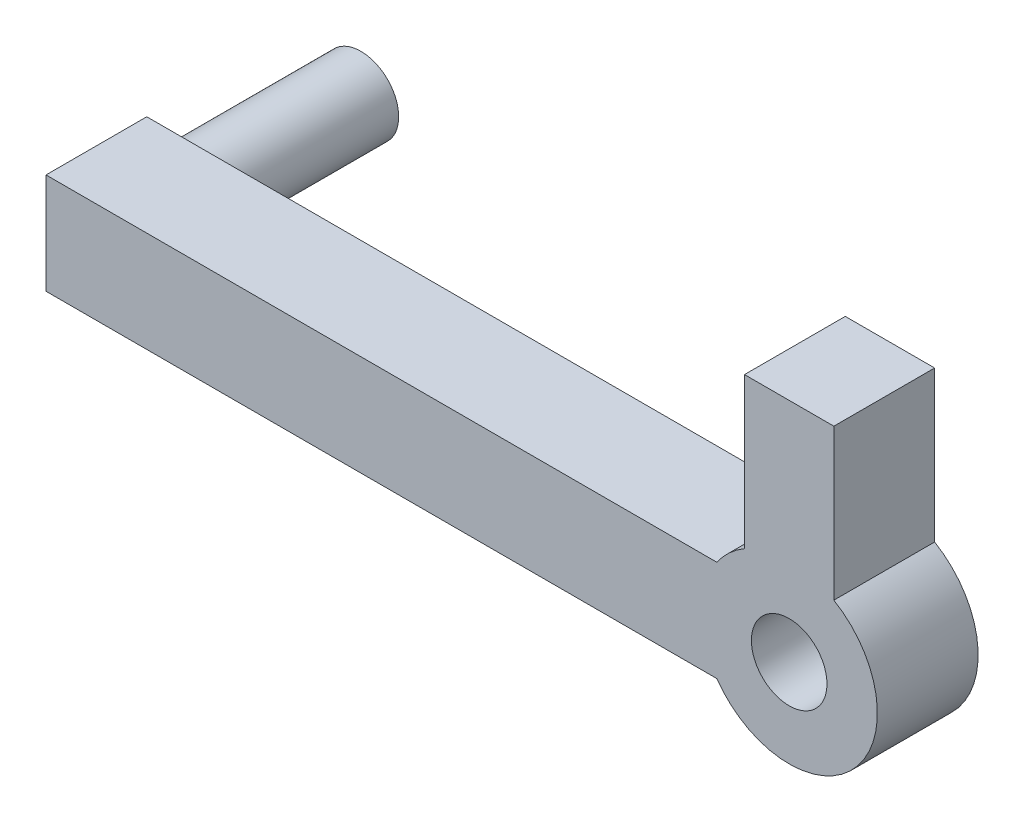
ISO-10303-21;
HEADER;
FILE_DESCRIPTION(('STEP AP214'),'2;1');
FILE_NAME('part.step','',(''),(''),'','','');
FILE_SCHEMA(('AUTOMOTIVE_DESIGN { 1 0 10303 214 1 1 1 1 }'));
ENDSEC;
DATA;
#1=APPLICATION_CONTEXT('core data for automotive mechanical design processes');
#2=APPLICATION_PROTOCOL_DEFINITION('international standard','automotive_design',2000,#1);
#3=PRODUCT_CONTEXT('',#1,'mechanical');
#4=PRODUCT('Part','Part','',(#3));
#5=PRODUCT_RELATED_PRODUCT_CATEGORY('part','',(#4));
#6=PRODUCT_DEFINITION_FORMATION('','',#4);
#7=PRODUCT_DEFINITION_CONTEXT('part definition',#1,'design');
#8=PRODUCT_DEFINITION('design','',#6,#7);
#9=PRODUCT_DEFINITION_SHAPE('','',#8);
#10=(LENGTH_UNIT() NAMED_UNIT(*) SI_UNIT(.MILLI.,.METRE.));
#11=(NAMED_UNIT(*) PLANE_ANGLE_UNIT() SI_UNIT($,.RADIAN.));
#12=(NAMED_UNIT(*) SI_UNIT($,.STERADIAN.) SOLID_ANGLE_UNIT());
#13=UNCERTAINTY_MEASURE_WITH_UNIT(LENGTH_MEASURE(1.E-05),#10,'distance_accuracy_value','');
#14=(GEOMETRIC_REPRESENTATION_CONTEXT(3) GLOBAL_UNCERTAINTY_ASSIGNED_CONTEXT((#13)) GLOBAL_UNIT_ASSIGNED_CONTEXT((#10,
#11,#12)) REPRESENTATION_CONTEXT('',''));
#15=CARTESIAN_POINT('',(0.,0.,0.));
#16=DIRECTION('',(0.,0.,1.));
#17=DIRECTION('',(1.,0.,0.));
#18=AXIS2_PLACEMENT_3D('',#15,#16,#17);
#19=CARTESIAN_POINT('',(147.5,10.,20.));
#20=DIRECTION('',(0.,0.,-1.));
#21=DIRECTION('',(-1.,0.,0.));
#22=AXIS2_PLACEMENT_3D('',#19,#20,#21);
#23=CYLINDRICAL_SURFACE('',#22,17.5);
#24=CARTESIAN_POINT('',(147.5,10.,20.));
#25=DIRECTION('',(0.,0.,1.));
#26=DIRECTION('',(1.,0.,0.));
#27=AXIS2_PLACEMENT_3D('',#24,#25,#26);
#28=CIRCLE('',#27,17.5);
#29=CARTESIAN_POINT('',(138.629925332049,25.0854822722038,20.));
#30=VERTEX_POINT('',#29);
#31=CARTESIAN_POINT('',(133.138593383655,20.,20.));
#32=VERTEX_POINT('',#31);
#33=EDGE_CURVE('E62',#30,#32,#28,.T.);
#34=ORIENTED_EDGE('',*,*,#33,.F.);
#35=DIRECTION('',(0.,0.,-1.));
#36=VECTOR('',#35,1.);
#37=CARTESIAN_POINT('',(138.629925332049,25.0854822722038,20.));
#38=LINE('',#37,#36);
#39=CARTESIAN_POINT('',(138.629925332049,25.0854822722038,0.));
#40=VERTEX_POINT('',#39);
#41=EDGE_CURVE('E122',#30,#40,#38,.T.);
#42=ORIENTED_EDGE('',*,*,#41,.T.);
#43=CARTESIAN_POINT('',(147.5,10.,0.));
#44=DIRECTION('',(0.,0.,1.));
#45=DIRECTION('',(1.,0.,0.));
#46=AXIS2_PLACEMENT_3D('',#43,#44,#45);
#47=CIRCLE('',#46,17.5);
#48=CARTESIAN_POINT('',(133.138593383655,20.,0.));
#49=VERTEX_POINT('',#48);
#50=EDGE_CURVE('E203',#40,#49,#47,.T.);
#51=ORIENTED_EDGE('',*,*,#50,.T.);
#52=DIRECTION('',(0.,0.,-1.));
#53=VECTOR('',#52,1.);
#54=CARTESIAN_POINT('',(133.138593383655,20.,20.));
#55=LINE('',#54,#53);
#56=EDGE_CURVE('E213',#32,#49,#55,.T.);
#57=ORIENTED_EDGE('',*,*,#56,.F.);
#58=EDGE_LOOP('',(#34,#42,#51,#57));
#59=FACE_BOUND('',#58,.T.);
#60=ADVANCED_FACE('F46',(#59),#23,.T.);
#61=CARTESIAN_POINT('',(0.,0.,20.));
#62=DIRECTION('',(-1.,0.,0.));
#63=DIRECTION('',(0.,0.,1.));
#64=AXIS2_PLACEMENT_3D('',#61,#62,#63);
#65=PLANE('',#64);
#66=DIRECTION('',(0.,1.,0.));
#67=VECTOR('',#66,1.);
#68=CARTESIAN_POINT('',(0.,0.,0.));
#69=LINE('',#68,#67);
#70=CARTESIAN_POINT('',(0.,0.,0.));
#71=VERTEX_POINT('',#70);
#72=CARTESIAN_POINT('',(0.,10.,0.));
#73=VERTEX_POINT('',#72);
#74=EDGE_CURVE('E196',#71,#73,#69,.T.);
#75=ORIENTED_EDGE('',*,*,#74,.F.);
#76=DIRECTION('',(0.,0.,-1.));
#77=VECTOR('',#76,1.);
#78=CARTESIAN_POINT('',(0.,0.,20.));
#79=LINE('',#78,#77);
#80=CARTESIAN_POINT('',(0.,0.,20.));
#81=VERTEX_POINT('',#80);
#82=EDGE_CURVE('E11',#81,#71,#79,.T.);
#83=ORIENTED_EDGE('',*,*,#82,.F.);
#84=DIRECTION('',(0.,1.,0.));
#85=VECTOR('',#84,1.);
#86=CARTESIAN_POINT('',(0.,0.,20.));
#87=LINE('',#86,#85);
#88=CARTESIAN_POINT('',(0.,20.,20.));
#89=VERTEX_POINT('',#88);
#90=EDGE_CURVE('E175',#81,#89,#87,.T.);
#91=ORIENTED_EDGE('',*,*,#90,.T.);
#92=DIRECTION('',(0.,0.,-1.));
#93=VECTOR('',#92,1.);
#94=CARTESIAN_POINT('',(0.,20.,20.));
#95=LINE('',#94,#93);
#96=CARTESIAN_POINT('',(0.,20.,0.));
#97=VERTEX_POINT('',#96);
#98=EDGE_CURVE('E191',#89,#97,#95,.T.);
#99=ORIENTED_EDGE('',*,*,#98,.T.);
#100=EDGE_CURVE('E195',#73,#97,#69,.T.);
#101=ORIENTED_EDGE('',*,*,#100,.F.);
#102=EDGE_LOOP('',(#75,#83,#91,#99,#101));
#103=FACE_BOUND('',#102,.T.);
#104=ADVANCED_FACE('F232',(#103),#65,.T.);
#105=CARTESIAN_POINT('',(0.,0.,20.));
#106=DIRECTION('',(0.,1.,0.));
#107=DIRECTION('',(0.,0.,1.));
#108=AXIS2_PLACEMENT_3D('',#105,#106,#107);
#109=PLANE('',#108);
#110=DIRECTION('',(1.,0.,0.));
#111=VECTOR('',#110,1.);
#112=CARTESIAN_POINT('',(0.,0.,0.));
#113=LINE('',#112,#111);
#114=CARTESIAN_POINT('',(133.138593383655,0.,0.));
#115=VERTEX_POINT('',#114);
#116=EDGE_CURVE('E199',#71,#115,#113,.T.);
#117=ORIENTED_EDGE('',*,*,#116,.T.);
#118=DIRECTION('',(0.,0.,-1.));
#119=VECTOR('',#118,1.);
#120=CARTESIAN_POINT('',(133.138593383655,0.,20.));
#121=LINE('',#120,#119);
#122=CARTESIAN_POINT('',(133.138593383655,0.,20.));
#123=VERTEX_POINT('',#122);
#124=EDGE_CURVE('E55',#123,#115,#121,.T.);
#125=ORIENTED_EDGE('',*,*,#124,.F.);
#126=DIRECTION('',(1.,0.,0.));
#127=VECTOR('',#126,1.);
#128=CARTESIAN_POINT('',(0.,0.,20.));
#129=LINE('',#128,#127);
#130=EDGE_CURVE('E180',#81,#123,#129,.T.);
#131=ORIENTED_EDGE('',*,*,#130,.F.);
#132=ORIENTED_EDGE('',*,*,#82,.T.);
#133=EDGE_LOOP('',(#117,#125,#131,#132));
#134=FACE_BOUND('',#133,.T.);
#135=ADVANCED_FACE('F224',(#134),#109,.F.);
#136=CARTESIAN_POINT('',(156.367480213696,25.0870074786126,0.));
#137=VERTEX_POINT('',#136);
#138=EDGE_CURVE('E204',#115,#137,#47,.T.);
#139=ORIENTED_EDGE('',*,*,#138,.T.);
#140=DIRECTION('',(0.,0.,-1.));
#141=VECTOR('',#140,1.);
#142=CARTESIAN_POINT('',(156.367480213696,25.0870074786126,20.));
#143=LINE('',#142,#141);
#144=CARTESIAN_POINT('',(156.367480213696,25.0870074786126,20.));
#145=VERTEX_POINT('',#144);
#146=EDGE_CURVE('E70',#137,#145,#143,.F.);
#147=ORIENTED_EDGE('',*,*,#146,.T.);
#148=EDGE_CURVE('E184',#123,#145,#28,.T.);
#149=ORIENTED_EDGE('',*,*,#148,.F.);
#150=ORIENTED_EDGE('',*,*,#124,.T.);
#151=EDGE_LOOP('',(#139,#147,#149,#150));
#152=FACE_BOUND('',#151,.T.);
#153=ADVANCED_FACE('F220',(#152),#23,.T.);
#154=CARTESIAN_POINT('',(147.5,10.,20.));
#155=DIRECTION('',(0.,0.,-1.));
#156=DIRECTION('',(-1.,0.,0.));
#157=AXIS2_PLACEMENT_3D('',#154,#155,#156);
#158=CYLINDRICAL_SURFACE('',#157,7.50000000000001);
#159=CARTESIAN_POINT('',(147.5,10.,20.));
#160=DIRECTION('',(0.,0.,1.));
#161=DIRECTION('',(1.,0.,0.));
#162=AXIS2_PLACEMENT_3D('',#159,#160,#161);
#163=CIRCLE('',#162,7.50000000000001);
#164=CARTESIAN_POINT('',(155.,10.,20.));
#165=VERTEX_POINT('',#164);
#166=EDGE_CURVE('E171',#165,#165,#163,.T.);
#167=ORIENTED_EDGE('',*,*,#166,.T.);
#168=EDGE_LOOP('',(#167));
#169=FACE_BOUND('',#168,.T.);
#170=CARTESIAN_POINT('',(147.5,10.,0.));
#171=DIRECTION('',(0.,0.,1.));
#172=DIRECTION('',(1.,0.,0.));
#173=AXIS2_PLACEMENT_3D('',#170,#171,#172);
#174=CIRCLE('',#173,7.50000000000001);
#175=CARTESIAN_POINT('',(155.,10.,0.));
#176=VERTEX_POINT('',#175);
#177=EDGE_CURVE('E167',#176,#176,#174,.T.);
#178=ORIENTED_EDGE('',*,*,#177,.F.);
#179=EDGE_LOOP('',(#178));
#180=FACE_BOUND('',#179,.T.);
#181=ADVANCED_FACE('F48',(#169,#180),#158,.F.);
#182=CARTESIAN_POINT('',(0.,20.,20.));
#183=DIRECTION('',(0.,1.,0.));
#184=DIRECTION('',(0.,0.,1.));
#185=AXIS2_PLACEMENT_3D('',#182,#183,#184);
#186=PLANE('',#185);
#187=DIRECTION('',(1.,0.,0.));
#188=VECTOR('',#187,1.);
#189=CARTESIAN_POINT('',(0.,20.,0.));
#190=LINE('',#189,#188);
#191=EDGE_CURVE('E176',#97,#49,#190,.T.);
#192=ORIENTED_EDGE('',*,*,#191,.F.);
#193=ORIENTED_EDGE('',*,*,#98,.F.);
#194=DIRECTION('',(1.,0.,0.));
#195=VECTOR('',#194,1.);
#196=CARTESIAN_POINT('',(0.,20.,20.));
#197=LINE('',#196,#195);
#198=EDGE_CURVE('E187',#89,#32,#197,.T.);
#199=ORIENTED_EDGE('',*,*,#198,.T.);
#200=ORIENTED_EDGE('',*,*,#56,.T.);
#201=EDGE_LOOP('',(#192,#193,#199,#200));
#202=FACE_BOUND('',#201,.T.);
#203=ADVANCED_FACE('F262',(#202),#186,.T.);
#204=CARTESIAN_POINT('',(0.,0.,20.));
#205=DIRECTION('',(0.,0.,1.));
#206=DIRECTION('',(1.,0.,0.));
#207=AXIS2_PLACEMENT_3D('',#204,#205,#206);
#208=PLANE('',#207);
#209=ORIENTED_EDGE('',*,*,#148,.T.);
#210=DIRECTION('',(0.,-1.,0.));
#211=VECTOR('',#210,1.);
#212=CARTESIAN_POINT('',(156.367480213696,55.,20.));
#213=LINE('',#212,#211);
#214=CARTESIAN_POINT('',(156.367480213696,55.,20.));
#215=VERTEX_POINT('',#214);
#216=EDGE_CURVE('E125',#215,#145,#213,.T.);
#217=ORIENTED_EDGE('',*,*,#216,.F.);
#218=DIRECTION('',(1.,0.,0.));
#219=VECTOR('',#218,1.);
#220=CARTESIAN_POINT('',(0.,55.,20.));
#221=LINE('',#220,#219);
#222=CARTESIAN_POINT('',(138.629925332049,55.,20.));
#223=VERTEX_POINT('',#222);
#224=EDGE_CURVE('E128',#223,#215,#221,.T.);
#225=ORIENTED_EDGE('',*,*,#224,.F.);
#226=DIRECTION('',(0.,-1.,0.));
#227=VECTOR('',#226,1.);
#228=CARTESIAN_POINT('',(138.629925332049,55.,20.));
#229=LINE('',#228,#227);
#230=EDGE_CURVE('E115',#223,#30,#229,.T.);
#231=ORIENTED_EDGE('',*,*,#230,.T.);
#232=ORIENTED_EDGE('',*,*,#33,.T.);
#233=ORIENTED_EDGE('',*,*,#198,.F.);
#234=ORIENTED_EDGE('',*,*,#90,.F.);
#235=ORIENTED_EDGE('',*,*,#130,.T.);
#236=EDGE_LOOP('',(#209,#217,#225,#231,#232,#233,#234,#235));
#237=FACE_BOUND('',#236,.T.);
#238=ORIENTED_EDGE('',*,*,#166,.F.);
#239=EDGE_LOOP('',(#238));
#240=FACE_BOUND('',#239,.T.);
#241=ADVANCED_FACE('F129',(#237,#240),#208,.T.);
#242=CARTESIAN_POINT('',(0.,0.,0.));
#243=DIRECTION('',(0.,0.,1.));
#244=DIRECTION('',(1.,0.,0.));
#245=AXIS2_PLACEMENT_3D('',#242,#243,#244);
#246=PLANE('',#245);
#247=ORIENTED_EDGE('',*,*,#50,.F.);
#248=DIRECTION('',(0.,-1.,0.));
#249=VECTOR('',#248,1.);
#250=CARTESIAN_POINT('',(138.629925332049,55.,0.));
#251=LINE('',#250,#249);
#252=CARTESIAN_POINT('',(138.629925332049,55.,0.));
#253=VERTEX_POINT('',#252);
#254=EDGE_CURVE('E149',#253,#40,#251,.T.);
#255=ORIENTED_EDGE('',*,*,#254,.F.);
#256=DIRECTION('',(1.,0.,0.));
#257=VECTOR('',#256,1.);
#258=CARTESIAN_POINT('',(0.,55.,0.));
#259=LINE('',#258,#257);
#260=CARTESIAN_POINT('',(156.367480213696,55.,0.));
#261=VERTEX_POINT('',#260);
#262=EDGE_CURVE('E140',#253,#261,#259,.T.);
#263=ORIENTED_EDGE('',*,*,#262,.T.);
#264=DIRECTION('',(0.,-1.,0.));
#265=VECTOR('',#264,1.);
#266=CARTESIAN_POINT('',(156.367480213696,55.,0.));
#267=LINE('',#266,#265);
#268=EDGE_CURVE('E152',#261,#137,#267,.T.);
#269=ORIENTED_EDGE('',*,*,#268,.T.);
#270=ORIENTED_EDGE('',*,*,#138,.F.);
#271=ORIENTED_EDGE('',*,*,#116,.F.);
#272=ORIENTED_EDGE('',*,*,#74,.T.);
#273=CARTESIAN_POINT('',(7.5,10.,0.));
#274=DIRECTION('',(0.,0.,-1.));
#275=DIRECTION('',(-1.,0.,0.));
#276=AXIS2_PLACEMENT_3D('',#273,#274,#275);
#277=CIRCLE('',#276,7.5);
#278=EDGE_CURVE('E162',#73,#73,#277,.T.);
#279=ORIENTED_EDGE('',*,*,#278,.F.);
#280=ORIENTED_EDGE('',*,*,#100,.T.);
#281=ORIENTED_EDGE('',*,*,#191,.T.);
#282=EDGE_LOOP('',(#247,#255,#263,#269,#270,#271,#272,#279,#280,#281));
#283=FACE_BOUND('',#282,.T.);
#284=ORIENTED_EDGE('',*,*,#177,.T.);
#285=EDGE_LOOP('',(#284));
#286=FACE_BOUND('',#285,.T.);
#287=ADVANCED_FACE('F227',(#283,#286),#246,.F.);
#288=CARTESIAN_POINT('',(7.5,10.,-35.));
#289=DIRECTION('',(0.,0.,1.));
#290=DIRECTION('',(1.,0.,0.));
#291=AXIS2_PLACEMENT_3D('',#288,#289,#290);
#292=CYLINDRICAL_SURFACE('',#291,7.5);
#293=CARTESIAN_POINT('',(7.5,10.,-35.));
#294=DIRECTION('',(0.,0.,-1.));
#295=DIRECTION('',(-1.,0.,0.));
#296=AXIS2_PLACEMENT_3D('',#293,#294,#295);
#297=CIRCLE('',#296,7.5);
#298=CARTESIAN_POINT('',(0.,10.,-35.));
#299=VERTEX_POINT('',#298);
#300=EDGE_CURVE('E163',#299,#299,#297,.T.);
#301=ORIENTED_EDGE('',*,*,#300,.F.);
#302=EDGE_LOOP('',(#301));
#303=FACE_BOUND('',#302,.T.);
#304=ORIENTED_EDGE('',*,*,#278,.T.);
#305=EDGE_LOOP('',(#304));
#306=FACE_BOUND('',#305,.T.);
#307=ADVANCED_FACE('F236',(#303,#306),#292,.T.);
#308=CARTESIAN_POINT('',(7.5,10.,-35.));
#309=DIRECTION('',(0.,0.,-1.));
#310=DIRECTION('',(-1.,0.,0.));
#311=AXIS2_PLACEMENT_3D('',#308,#309,#310);
#312=PLANE('',#311);
#313=ORIENTED_EDGE('',*,*,#300,.T.);
#314=EDGE_LOOP('',(#313));
#315=FACE_BOUND('',#314,.T.);
#316=ADVANCED_FACE('F238',(#315),#312,.T.);
#317=CARTESIAN_POINT('',(138.629925332049,55.,0.));
#318=DIRECTION('',(-1.,0.,0.));
#319=DIRECTION('',(0.,0.,1.));
#320=AXIS2_PLACEMENT_3D('',#317,#318,#319);
#321=PLANE('',#320);
#322=ORIENTED_EDGE('',*,*,#41,.F.);
#323=ORIENTED_EDGE('',*,*,#230,.F.);
#324=DIRECTION('',(0.,0.,-1.));
#325=VECTOR('',#324,1.);
#326=CARTESIAN_POINT('',(138.629925332049,55.,0.));
#327=LINE('',#326,#325);
#328=EDGE_CURVE('E120',#223,#253,#327,.T.);
#329=ORIENTED_EDGE('',*,*,#328,.T.);
#330=ORIENTED_EDGE('',*,*,#254,.T.);
#331=EDGE_LOOP('',(#322,#323,#329,#330));
#332=FACE_BOUND('',#331,.T.);
#333=ADVANCED_FACE('F117',(#332),#321,.T.);
#334=CARTESIAN_POINT('',(156.367480213696,55.,0.));
#335=DIRECTION('',(1.,0.,0.));
#336=DIRECTION('',(0.,0.,-1.));
#337=AXIS2_PLACEMENT_3D('',#334,#335,#336);
#338=PLANE('',#337);
#339=ORIENTED_EDGE('',*,*,#146,.F.);
#340=ORIENTED_EDGE('',*,*,#268,.F.);
#341=DIRECTION('',(0.,0.,1.));
#342=VECTOR('',#341,1.);
#343=CARTESIAN_POINT('',(156.367480213696,55.,0.));
#344=LINE('',#343,#342);
#345=EDGE_CURVE('E136',#261,#215,#344,.T.);
#346=ORIENTED_EDGE('',*,*,#345,.T.);
#347=ORIENTED_EDGE('',*,*,#216,.T.);
#348=EDGE_LOOP('',(#339,#340,#346,#347));
#349=FACE_BOUND('',#348,.T.);
#350=ADVANCED_FACE('F323',(#349),#338,.T.);
#351=CARTESIAN_POINT('',(0.,55.,0.));
#352=DIRECTION('',(0.,1.,0.));
#353=DIRECTION('',(0.,0.,1.));
#354=AXIS2_PLACEMENT_3D('',#351,#352,#353);
#355=PLANE('',#354);
#356=ORIENTED_EDGE('',*,*,#328,.F.);
#357=ORIENTED_EDGE('',*,*,#224,.T.);
#358=ORIENTED_EDGE('',*,*,#345,.F.);
#359=ORIENTED_EDGE('',*,*,#262,.F.);
#360=EDGE_LOOP('',(#356,#357,#358,#359));
#361=FACE_BOUND('',#360,.T.);
#362=ADVANCED_FACE('F138',(#361),#355,.T.);
#363=CLOSED_SHELL('',(#60,#104,#135,#153,#181,#203,#241,#287,#307,#316,#333,#350,#362));
#364=MANIFOLD_SOLID_BREP('B2',#363);
#365=ADVANCED_BREP_SHAPE_REPRESENTATION('',(#18,#364),#14);
#366=SHAPE_DEFINITION_REPRESENTATION(#9,#365);
ENDSEC;
END-ISO-10303-21;
